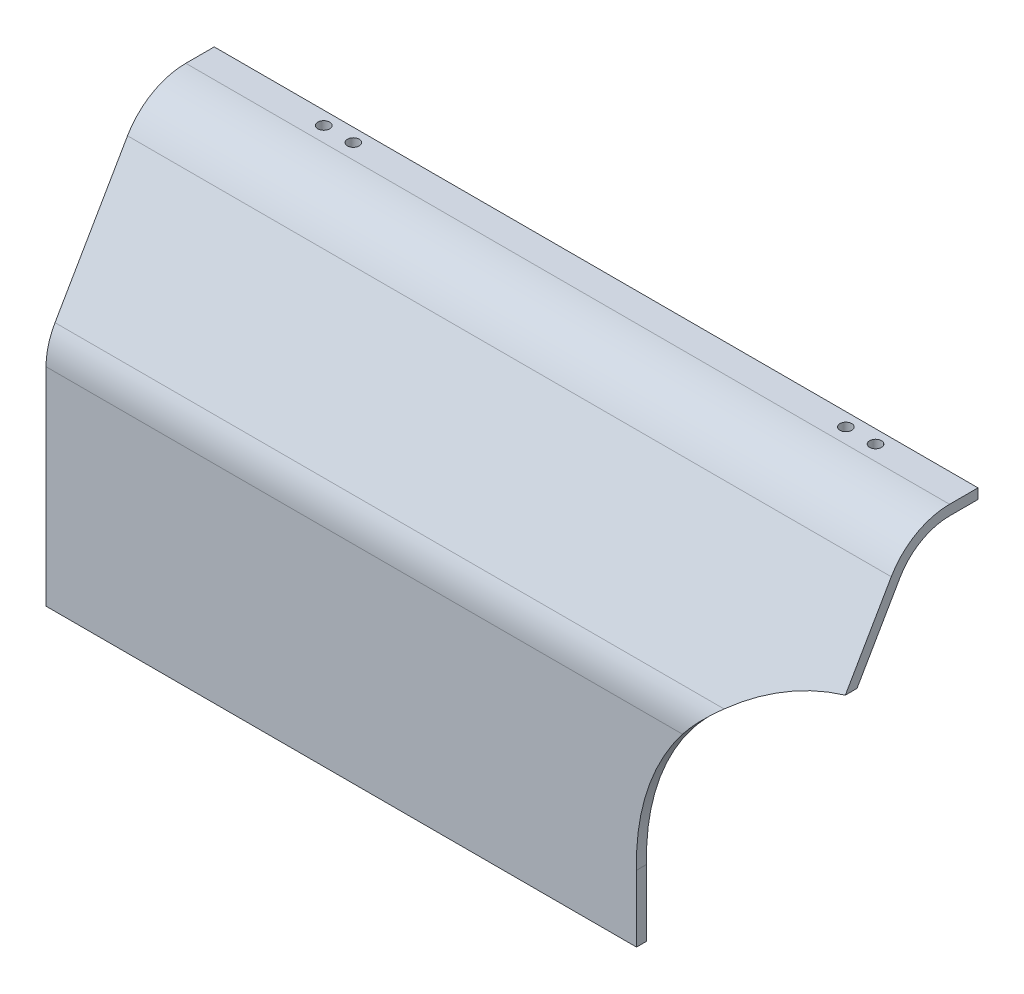
ISO-10303-21;
HEADER;
FILE_DESCRIPTION(('STEP AP214'),'2;1');
FILE_NAME('part.step','',(''),(''),'','','');
FILE_SCHEMA(('AUTOMOTIVE_DESIGN { 1 0 10303 214 1 1 1 1 }'));
ENDSEC;
DATA;
#1=APPLICATION_CONTEXT('core data for automotive mechanical design processes');
#2=APPLICATION_PROTOCOL_DEFINITION('international standard','automotive_design',2000,#1);
#3=PRODUCT_CONTEXT('',#1,'mechanical');
#4=PRODUCT('Part','Part','',(#3));
#5=PRODUCT_RELATED_PRODUCT_CATEGORY('part','',(#4));
#6=PRODUCT_DEFINITION_FORMATION('','',#4);
#7=PRODUCT_DEFINITION_CONTEXT('part definition',#1,'design');
#8=PRODUCT_DEFINITION('design','',#6,#7);
#9=PRODUCT_DEFINITION_SHAPE('','',#8);
#10=(LENGTH_UNIT() NAMED_UNIT(*) SI_UNIT(.MILLI.,.METRE.));
#11=(NAMED_UNIT(*) PLANE_ANGLE_UNIT() SI_UNIT($,.RADIAN.));
#12=(NAMED_UNIT(*) SI_UNIT($,.STERADIAN.) SOLID_ANGLE_UNIT());
#13=UNCERTAINTY_MEASURE_WITH_UNIT(LENGTH_MEASURE(1.E-05),#10,'distance_accuracy_value','');
#14=(GEOMETRIC_REPRESENTATION_CONTEXT(3) GLOBAL_UNCERTAINTY_ASSIGNED_CONTEXT((#13)) GLOBAL_UNIT_ASSIGNED_CONTEXT((#10,
#11,#12)) REPRESENTATION_CONTEXT('',''));
#15=CARTESIAN_POINT('',(0.,0.,0.));
#16=DIRECTION('',(0.,0.,1.));
#17=DIRECTION('',(1.,0.,0.));
#18=AXIS2_PLACEMENT_3D('',#15,#16,#17);
#19=CARTESIAN_POINT('',(126.978079309447,21.7215242270664,-46.9999999999999));
#20=DIRECTION('',(0.,0.,1.));
#21=DIRECTION('',(1.,0.,0.));
#22=AXIS2_PLACEMENT_3D('',#19,#20,#21);
#23=CYLINDRICAL_SURFACE('',#22,65.);
#24=DIRECTION('',(0.,0.,1.));
#25=VECTOR('',#24,1.);
#26=CARTESIAN_POINT('',(62.0070393434519,19.7814299672324,-46.9999999999999));
#27=LINE('',#26,#25);
#28=CARTESIAN_POINT('',(62.0070393434519,19.7814299672324,0.));
#29=VERTEX_POINT('',#28);
#30=CARTESIAN_POINT('',(62.0070393434519,19.7814299672324,3.));
#31=VERTEX_POINT('',#30);
#32=EDGE_CURVE('E11',#29,#31,#27,.T.);
#33=ORIENTED_EDGE('',*,*,#32,.F.);
#34=CARTESIAN_POINT('',(126.978079309447,21.7215242270664,0.));
#35=DIRECTION('',(0.,0.,1.));
#36=DIRECTION('',(1.,0.,0.));
#37=AXIS2_PLACEMENT_3D('',#34,#35,#36);
#38=CIRCLE('',#37,65.);
#39=CARTESIAN_POINT('',(75.6805728933955,61.6410161513776,0.));
#40=VERTEX_POINT('',#39);
#41=EDGE_CURVE('E73',#40,#29,#38,.T.);
#42=ORIENTED_EDGE('',*,*,#41,.F.);
#43=CARTESIAN_POINT('',(83.6127382893241,70.1410161513775,-2.27756813566452));
#44=CARTESIAN_POINT('',(83.3616480089941,69.9161368445691,-2.14774277892059));
#45=CARTESIAN_POINT('',(83.1108968713338,69.6880378023944,-2.022910582567));
#46=CARTESIAN_POINT('',(82.6103880980552,69.225461955044,-1.78342741323763));
#47=CARTESIAN_POINT('',(82.3606305217447,68.9909847755029,-1.66877703957697));
#48=CARTESIAN_POINT('',(81.6129110690012,68.2776855465004,-1.34021349171037));
#49=CARTESIAN_POINT('',(81.1169615795753,67.7894061751419,-1.14192540380267));
#50=CARTESIAN_POINT('',(80.1410265578371,66.7966579221638,-0.792221566908949));
#51=CARTESIAN_POINT('',(79.6609128884381,66.2925504696603,-0.640135838045368));
#52=CARTESIAN_POINT('',(78.711846950537,65.2630049176842,-0.38185912734132));
#53=CARTESIAN_POINT('',(78.2428877036457,64.7375807424716,-0.275638697577599));
#54=CARTESIAN_POINT('',(77.4226029410888,63.7876039616179,-0.130847975804375));
#55=CARTESIAN_POINT('',(77.0685241862307,63.3669160665213,-0.082439506259715));
#56=CARTESIAN_POINT('',(76.3679292860928,62.5127073981101,-0.0169332948677176));
#57=CARTESIAN_POINT('',(76.0214706384217,62.079125185968,-2.3470333731656E-05));
#58=CARTESIAN_POINT('',(75.6805728933955,61.6410161513775,0.));
#59=B_SPLINE_CURVE_WITH_KNOTS('',3,(#43,#44,#45,#46,#47,#48,#49,#50,#51,#52,#53,#54,#55,#56,#57,
#58),.UNSPECIFIED.,.F.,.F.,(4,2,2,2,2,2,2,4),(0.,1.0835220942305,2.16710792374517,
4.33625556596512,6.47225509648827,8.60688115684938,10.2618277297827,11.9266162888067),.UNSPECIFIED.);
#60=CARTESIAN_POINT('',(83.6127382893241,70.1410161513775,-2.27756813566452));
#61=VERTEX_POINT('',#60);
#62=EDGE_CURVE('E49',#61,#40,#59,.T.);
#63=ORIENTED_EDGE('',*,*,#62,.F.);
#64=CARTESIAN_POINT('',(126.978079309447,21.7215242270664,25.6774385608612));
#65=DIRECTION('',(0.,0.499999999999998,0.86602540378444));
#66=DIRECTION('',(0.,-0.86602540378444,0.499999999999998));
#67=AXIS2_PLACEMENT_3D('',#64,#65,#66);
#68=ELLIPSE('',#67,75.0555349946512,65.);
#69=CARTESIAN_POINT('',(113.5,85.3087979390935,-11.0346910338118));
#70=VERTEX_POINT('',#69);
#71=EDGE_CURVE('E168',#70,#61,#68,.T.);
#72=ORIENTED_EDGE('',*,*,#71,.F.);
#73=DIRECTION('',(0.,0.,1.));
#74=VECTOR('',#73,1.);
#75=CARTESIAN_POINT('',(113.5,85.3087979390935,-46.9999999999999));
#76=LINE('',#75,#74);
#77=CARTESIAN_POINT('',(113.5,85.3087979390935,-7.57058941867404));
#78=VERTEX_POINT('',#77);
#79=EDGE_CURVE('E173',#70,#78,#76,.T.);
#80=ORIENTED_EDGE('',*,*,#79,.T.);
#81=CARTESIAN_POINT('',(126.978079309447,21.7215242270664,29.141540175999));
#82=DIRECTION('',(0.,-0.499999999999998,-0.86602540378444));
#83=DIRECTION('',(0.,-0.86602540378444,0.499999999999998));
#84=AXIS2_PLACEMENT_3D('',#81,#82,#83);
#85=ELLIPSE('',#84,75.0555349946512,65.);
#86=CARTESIAN_POINT('',(85.3482303303957,71.6410161513775,0.320508075688807));
#87=VERTEX_POINT('',#86);
#88=EDGE_CURVE('E174',#87,#78,#85,.T.);
#89=ORIENTED_EDGE('',*,*,#88,.F.);
#90=CARTESIAN_POINT('',(85.3482303303956,71.6410161513775,0.320508075688803));
#91=CARTESIAN_POINT('',(85.0423347646692,71.385918487348,0.467779956475838));
#92=CARTESIAN_POINT('',(84.7373359272004,71.1267991919212,0.60987739744638));
#93=CARTESIAN_POINT('',(84.1294442324611,70.6005189772911,0.883381530419765));
#94=CARTESIAN_POINT('',(83.8265515489721,70.3333574039779,1.01478734959493));
#95=CARTESIAN_POINT('',(82.9209274384237,69.5192919046817,1.39269041840845));
#96=CARTESIAN_POINT('',(82.3219093985911,68.9603560010269,1.62255494704336));
#97=CARTESIAN_POINT('',(81.1463496848747,67.820467219122,2.03090085386978));
#98=CARTESIAN_POINT('',(80.5696033676565,67.2399916512797,2.21012542733044));
#99=CARTESIAN_POINT('',(79.4324335028515,66.0508336653938,2.51743662817031));
#100=CARTESIAN_POINT('',(78.8719990872263,65.4421707621948,2.64555806192083));
#101=CARTESIAN_POINT('',(77.8680197777471,64.3087208396667,2.82805757506313));
#102=CARTESIAN_POINT('',(77.4213498218331,63.7881671355725,2.89147658535113));
#103=CARTESIAN_POINT('',(76.7613349076728,62.9937692173334,2.95598294088116));
#104=CARTESIAN_POINT('',(76.542306109056,62.7258239609559,2.97238423065183));
#105=CARTESIAN_POINT('',(76.108319001179,62.1861687636352,2.99439233464156));
#106=CARTESIAN_POINT('',(75.8933611867286,61.9144583719194,2.99999784491459));
#107=CARTESIAN_POINT('',(75.6805728933956,61.6410161513776,3.));
#108=B_SPLINE_CURVE_WITH_KNOTS('',3,(#90,#91,#92,#93,#94,#95,#96,#97,#98,#99,#100,#101,#102,
#103,#104,#105,#106,#107),.UNSPECIFIED.,.F.,.F.,(4,2,2,2,2,2,2,2,4),(0.,1.27387284327257,
2.5478495770697,5.09854318077426,7.60958681315375,10.1189172401118,12.1838951410936,
13.2230970100514,14.2624243890008),.UNSPECIFIED.);
#109=CARTESIAN_POINT('',(75.6805728933956,61.6410161513776,3.));
#110=VERTEX_POINT('',#109);
#111=EDGE_CURVE('E164',#87,#110,#108,.T.);
#112=ORIENTED_EDGE('',*,*,#111,.T.);
#113=CARTESIAN_POINT('',(126.978079309447,21.7215242270664,3.));
#114=DIRECTION('',(0.,0.,1.));
#115=DIRECTION('',(1.,0.,0.));
#116=AXIS2_PLACEMENT_3D('',#113,#114,#115);
#117=CIRCLE('',#116,65.);
#118=EDGE_CURVE('E156',#110,#31,#117,.T.);
#119=ORIENTED_EDGE('',*,*,#118,.T.);
#120=EDGE_LOOP('',(#33,#42,#63,#72,#80,#89,#112,#119));
#121=FACE_BOUND('',#120,.T.);
#122=ADVANCED_FACE('F44',(#121),#23,.F.);
#123=CARTESIAN_POINT('',(113.5,67.,3.));
#124=DIRECTION('',(0.,0.,-1.));
#125=DIRECTION('',(0.,1.,0.));
#126=AXIS2_PLACEMENT_3D('',#123,#124,#125);
#127=PLANE('',#126);
#128=DIRECTION('',(0.,-1.,0.));
#129=VECTOR('',#128,1.);
#130=CARTESIAN_POINT('',(62.0070393434519,0.,3.));
#131=LINE('',#130,#129);
#132=CARTESIAN_POINT('',(62.0070393434519,0.,3.));
#133=VERTEX_POINT('',#132);
#134=EDGE_CURVE('E155',#31,#133,#131,.T.);
#135=ORIENTED_EDGE('',*,*,#134,.F.);
#136=ORIENTED_EDGE('',*,*,#118,.F.);
#137=DIRECTION('',(-1.,0.,0.));
#138=VECTOR('',#137,1.);
#139=CARTESIAN_POINT('',(113.5,61.6410161513776,3.));
#140=LINE('',#139,#138);
#141=CARTESIAN_POINT('',(-113.5,61.6410161513776,3.));
#142=VERTEX_POINT('',#141);
#143=EDGE_CURVE('E256',#110,#142,#140,.T.);
#144=ORIENTED_EDGE('',*,*,#143,.T.);
#145=DIRECTION('',(0.,-1.,0.));
#146=VECTOR('',#145,1.);
#147=CARTESIAN_POINT('',(-113.5,67.,3.));
#148=LINE('',#147,#146);
#149=CARTESIAN_POINT('',(-113.5,0.,3.));
#150=VERTEX_POINT('',#149);
#151=EDGE_CURVE('E316',#142,#150,#148,.T.);
#152=ORIENTED_EDGE('',*,*,#151,.T.);
#153=DIRECTION('',(-1.,0.,0.));
#154=VECTOR('',#153,1.);
#155=CARTESIAN_POINT('',(113.5,0.,3.));
#156=LINE('',#155,#154);
#157=EDGE_CURVE('E162',#133,#150,#156,.T.);
#158=ORIENTED_EDGE('',*,*,#157,.F.);
#159=EDGE_LOOP('',(#135,#136,#144,#152,#158));
#160=FACE_BOUND('',#159,.T.);
#161=ADVANCED_FACE('F159',(#160),#127,.F.);
#162=CARTESIAN_POINT('',(113.5,0.,3.));
#163=DIRECTION('',(0.,1.,0.));
#164=DIRECTION('',(0.,0.,1.));
#165=AXIS2_PLACEMENT_3D('',#162,#163,#164);
#166=PLANE('',#165);
#167=DIRECTION('',(-1.,0.,0.));
#168=VECTOR('',#167,1.);
#169=CARTESIAN_POINT('',(113.5,0.,0.));
#170=LINE('',#169,#168);
#171=CARTESIAN_POINT('',(62.0070393434519,0.,0.));
#172=VERTEX_POINT('',#171);
#173=CARTESIAN_POINT('',(-113.5,0.,0.));
#174=VERTEX_POINT('',#173);
#175=EDGE_CURVE('E255',#172,#174,#170,.T.);
#176=ORIENTED_EDGE('',*,*,#175,.F.);
#177=DIRECTION('',(0.,0.,1.));
#178=VECTOR('',#177,1.);
#179=CARTESIAN_POINT('',(62.0070393434519,0.,-46.9999999999999));
#180=LINE('',#179,#178);
#181=EDGE_CURVE('E70',#172,#133,#180,.T.);
#182=ORIENTED_EDGE('',*,*,#181,.T.);
#183=ORIENTED_EDGE('',*,*,#157,.T.);
#184=DIRECTION('',(0.,0.,-1.));
#185=VECTOR('',#184,1.);
#186=CARTESIAN_POINT('',(-113.5,0.,3.));
#187=LINE('',#186,#185);
#188=EDGE_CURVE('E251',#150,#174,#187,.T.);
#189=ORIENTED_EDGE('',*,*,#188,.T.);
#190=EDGE_LOOP('',(#176,#182,#183,#189));
#191=FACE_BOUND('',#190,.T.);
#192=ADVANCED_FACE('F224',(#191),#166,.F.);
#193=CARTESIAN_POINT('',(113.5,0.,0.));
#194=DIRECTION('',(0.,0.,1.));
#195=DIRECTION('',(1.,0.,0.));
#196=AXIS2_PLACEMENT_3D('',#193,#194,#195);
#197=PLANE('',#196);
#198=ORIENTED_EDGE('',*,*,#41,.T.);
#199=DIRECTION('',(0.,-1.,0.));
#200=VECTOR('',#199,1.);
#201=CARTESIAN_POINT('',(62.0070393434519,0.,0.));
#202=LINE('',#201,#200);
#203=EDGE_CURVE('E154',#29,#172,#202,.T.);
#204=ORIENTED_EDGE('',*,*,#203,.T.);
#205=ORIENTED_EDGE('',*,*,#175,.T.);
#206=DIRECTION('',(0.,1.,0.));
#207=VECTOR('',#206,1.);
#208=CARTESIAN_POINT('',(-113.5,0.,0.));
#209=LINE('',#208,#207);
#210=CARTESIAN_POINT('',(-113.5,61.6410161513776,0.));
#211=VERTEX_POINT('',#210);
#212=EDGE_CURVE('E305',#174,#211,#209,.T.);
#213=ORIENTED_EDGE('',*,*,#212,.T.);
#214=DIRECTION('',(-1.,0.,0.));
#215=VECTOR('',#214,1.);
#216=CARTESIAN_POINT('',(113.5,61.6410161513776,0.));
#217=LINE('',#216,#215);
#218=EDGE_CURVE('E295',#211,#40,#217,.F.);
#219=ORIENTED_EDGE('',*,*,#218,.T.);
#220=EDGE_LOOP('',(#198,#204,#205,#213,#219));
#221=FACE_BOUND('',#220,.T.);
#222=ADVANCED_FACE('F245',(#221),#197,.F.);
#223=CARTESIAN_POINT('',(113.5,66.1961524227066,0.));
#224=DIRECTION('',(0.,0.499999999999998,0.86602540378444));
#225=DIRECTION('',(0.,-0.86602540378444,0.499999999999998));
#226=AXIS2_PLACEMENT_3D('',#223,#224,#225);
#227=PLANE('',#226);
#228=DIRECTION('',(0.,0.86602540378444,-0.499999999999998));
#229=VECTOR('',#228,1.);
#230=CARTESIAN_POINT('',(113.5,66.1961524227066,0.));
#231=LINE('',#230,#229);
#232=CARTESIAN_POINT('',(113.5,107.461524227066,-23.8245735194569));
#233=VERTEX_POINT('',#232);
#234=EDGE_CURVE('E324',#70,#233,#231,.T.);
#235=ORIENTED_EDGE('',*,*,#234,.F.);
#236=ORIENTED_EDGE('',*,*,#71,.T.);
#237=DIRECTION('',(-1.,0.,0.));
#238=VECTOR('',#237,1.);
#239=CARTESIAN_POINT('',(-113.5,70.1410161513775,-2.27756813566452));
#240=LINE('',#239,#238);
#241=CARTESIAN_POINT('',(-113.5,70.1410161513775,-2.27756813566452));
#242=VERTEX_POINT('',#241);
#243=EDGE_CURVE('E292',#61,#242,#240,.T.);
#244=ORIENTED_EDGE('',*,*,#243,.T.);
#245=DIRECTION('',(0.,0.86602540378444,-0.499999999999998));
#246=VECTOR('',#245,1.);
#247=CARTESIAN_POINT('',(-113.5,66.1961524227066,0.));
#248=LINE('',#247,#246);
#249=CARTESIAN_POINT('',(-113.5,107.461524227066,-23.8245735194569));
#250=VERTEX_POINT('',#249);
#251=EDGE_CURVE('E303',#242,#250,#248,.T.);
#252=ORIENTED_EDGE('',*,*,#251,.T.);
#253=DIRECTION('',(-1.,0.,0.));
#254=VECTOR('',#253,1.);
#255=CARTESIAN_POINT('',(113.5,107.461524227066,-23.8245735194569));
#256=LINE('',#255,#254);
#257=EDGE_CURVE('E281',#250,#233,#256,.F.);
#258=ORIENTED_EDGE('',*,*,#257,.T.);
#259=EDGE_LOOP('',(#235,#236,#244,#252,#258));
#260=FACE_BOUND('',#259,.T.);
#261=ADVANCED_FACE('F238',(#260),#227,.F.);
#262=CARTESIAN_POINT('',(113.5,115.961524227066,-28.7320508075688));
#263=DIRECTION('',(0.,1.,0.));
#264=DIRECTION('',(0.,0.,1.));
#265=AXIS2_PLACEMENT_3D('',#262,#263,#264);
#266=PLANE('',#265);
#267=CARTESIAN_POINT('',(78.2,115.961524227066,-43.0470053837925));
#268=DIRECTION('',(0.,1.,0.));
#269=DIRECTION('',(0.,0.,1.));
#270=AXIS2_PLACEMENT_3D('',#267,#268,#269);
#271=CIRCLE('',#270,1.75);
#272=CARTESIAN_POINT('',(78.2,115.961524227066,-41.2970053837925));
#273=VERTEX_POINT('',#272);
#274=EDGE_CURVE('E356',#273,#273,#271,.T.);
#275=ORIENTED_EDGE('',*,*,#274,.T.);
#276=EDGE_LOOP('',(#275));
#277=FACE_BOUND('',#276,.T.);
#278=CARTESIAN_POINT('',(87.,115.961524227066,-43.0470053837925));
#279=DIRECTION('',(0.,1.,0.));
#280=DIRECTION('',(0.,0.,1.));
#281=AXIS2_PLACEMENT_3D('',#278,#279,#280);
#282=CIRCLE('',#281,1.75);
#283=CARTESIAN_POINT('',(87.,115.961524227066,-41.2970053837925));
#284=VERTEX_POINT('',#283);
#285=EDGE_CURVE('E361',#284,#284,#282,.T.);
#286=ORIENTED_EDGE('',*,*,#285,.T.);
#287=EDGE_LOOP('',(#286));
#288=FACE_BOUND('',#287,.T.);
#289=CARTESIAN_POINT('',(-77.,115.961524227066,-43.047005383793));
#290=DIRECTION('',(0.,1.,0.));
#291=DIRECTION('',(0.,0.,1.));
#292=AXIS2_PLACEMENT_3D('',#289,#290,#291);
#293=CIRCLE('',#292,1.75000000000001);
#294=CARTESIAN_POINT('',(-77.,115.961524227066,-41.297005383793));
#295=VERTEX_POINT('',#294);
#296=EDGE_CURVE('E310',#295,#295,#293,.T.);
#297=ORIENTED_EDGE('',*,*,#296,.T.);
#298=EDGE_LOOP('',(#297));
#299=FACE_BOUND('',#298,.T.);
#300=CARTESIAN_POINT('',(-68.2,115.961524227066,-43.047005383793));
#301=DIRECTION('',(0.,1.,0.));
#302=DIRECTION('',(0.,0.,1.));
#303=AXIS2_PLACEMENT_3D('',#300,#301,#302);
#304=CIRCLE('',#303,1.75);
#305=CARTESIAN_POINT('',(-68.2,115.961524227066,-41.297005383793));
#306=VERTEX_POINT('',#305);
#307=EDGE_CURVE('E352',#306,#306,#304,.T.);
#308=ORIENTED_EDGE('',*,*,#307,.T.);
#309=EDGE_LOOP('',(#308));
#310=FACE_BOUND('',#309,.T.);
#311=DIRECTION('',(0.,0.,-1.));
#312=VECTOR('',#311,1.);
#313=CARTESIAN_POINT('',(113.5,115.961524227066,-28.7320508075688));
#314=LINE('',#313,#312);
#315=CARTESIAN_POINT('',(113.5,115.961524227066,-38.5470053837924));
#316=VERTEX_POINT('',#315);
#317=CARTESIAN_POINT('',(113.5,115.961524227066,-46.9999999999999));
#318=VERTEX_POINT('',#317);
#319=EDGE_CURVE('E347',#316,#318,#314,.T.);
#320=ORIENTED_EDGE('',*,*,#319,.F.);
#321=DIRECTION('',(-1.,0.,0.));
#322=VECTOR('',#321,1.);
#323=CARTESIAN_POINT('',(-113.5,115.961524227066,-38.5470053837924));
#324=LINE('',#323,#322);
#325=CARTESIAN_POINT('',(-113.5,115.961524227066,-38.5470053837924));
#326=VERTEX_POINT('',#325);
#327=EDGE_CURVE('E282',#316,#326,#324,.T.);
#328=ORIENTED_EDGE('',*,*,#327,.T.);
#329=DIRECTION('',(0.,0.,-1.));
#330=VECTOR('',#329,1.);
#331=CARTESIAN_POINT('',(-113.5,115.961524227066,-28.7320508075688));
#332=LINE('',#331,#330);
#333=CARTESIAN_POINT('',(-113.5,115.961524227066,-46.9999999999999));
#334=VERTEX_POINT('',#333);
#335=EDGE_CURVE('E304',#326,#334,#332,.T.);
#336=ORIENTED_EDGE('',*,*,#335,.T.);
#337=DIRECTION('',(-1.,0.,0.));
#338=VECTOR('',#337,1.);
#339=CARTESIAN_POINT('',(113.5,115.961524227066,-46.9999999999999));
#340=LINE('',#339,#338);
#341=EDGE_CURVE('E260',#318,#334,#340,.T.);
#342=ORIENTED_EDGE('',*,*,#341,.F.);
#343=EDGE_LOOP('',(#320,#328,#336,#342));
#344=FACE_BOUND('',#343,.T.);
#345=ADVANCED_FACE('F234',(#277,#288,#299,#310,#344),#266,.F.);
#346=CARTESIAN_POINT('',(113.5,115.961524227066,-46.9999999999999));
#347=DIRECTION('',(0.,0.,1.));
#348=DIRECTION('',(1.,0.,0.));
#349=AXIS2_PLACEMENT_3D('',#346,#347,#348);
#350=PLANE('',#349);
#351=DIRECTION('',(0.,1.,0.));
#352=VECTOR('',#351,1.);
#353=CARTESIAN_POINT('',(-113.5,115.961524227066,-46.9999999999999));
#354=LINE('',#353,#352);
#355=CARTESIAN_POINT('',(-113.5,118.961524227066,-46.9999999999999));
#356=VERTEX_POINT('',#355);
#357=EDGE_CURVE('E315',#334,#356,#354,.T.);
#358=ORIENTED_EDGE('',*,*,#357,.T.);
#359=DIRECTION('',(-1.,0.,0.));
#360=VECTOR('',#359,1.);
#361=CARTESIAN_POINT('',(113.5,118.961524227066,-46.9999999999999));
#362=LINE('',#361,#360);
#363=CARTESIAN_POINT('',(113.5,118.961524227066,-46.9999999999999));
#364=VERTEX_POINT('',#363);
#365=EDGE_CURVE('E264',#364,#356,#362,.T.);
#366=ORIENTED_EDGE('',*,*,#365,.F.);
#367=DIRECTION('',(0.,1.,0.));
#368=VECTOR('',#367,1.);
#369=CARTESIAN_POINT('',(113.5,115.961524227066,-46.9999999999999));
#370=LINE('',#369,#368);
#371=EDGE_CURVE('E341',#318,#364,#370,.T.);
#372=ORIENTED_EDGE('',*,*,#371,.F.);
#373=ORIENTED_EDGE('',*,*,#341,.T.);
#374=EDGE_LOOP('',(#358,#366,#372,#373));
#375=FACE_BOUND('',#374,.T.);
#376=ADVANCED_FACE('F229',(#375),#350,.F.);
#377=CARTESIAN_POINT('',(113.5,118.961524227066,-46.9999999999999));
#378=DIRECTION('',(0.,-1.,0.));
#379=DIRECTION('',(0.,0.,-1.));
#380=AXIS2_PLACEMENT_3D('',#377,#378,#379);
#381=PLANE('',#380);
#382=CARTESIAN_POINT('',(78.2,118.961524227066,-43.0470053837925));
#383=DIRECTION('',(0.,1.,0.));
#384=DIRECTION('',(0.,0.,1.));
#385=AXIS2_PLACEMENT_3D('',#382,#383,#384);
#386=CIRCLE('',#385,1.75);
#387=CARTESIAN_POINT('',(78.2,118.961524227066,-41.2970053837925));
#388=VERTEX_POINT('',#387);
#389=EDGE_CURVE('E184',#388,#388,#386,.T.);
#390=ORIENTED_EDGE('',*,*,#389,.F.);
#391=EDGE_LOOP('',(#390));
#392=FACE_BOUND('',#391,.T.);
#393=CARTESIAN_POINT('',(87.,118.961524227066,-43.0470053837925));
#394=DIRECTION('',(0.,1.,0.));
#395=DIRECTION('',(0.,0.,1.));
#396=AXIS2_PLACEMENT_3D('',#393,#394,#395);
#397=CIRCLE('',#396,1.75);
#398=CARTESIAN_POINT('',(87.,118.961524227066,-41.2970053837925));
#399=VERTEX_POINT('',#398);
#400=EDGE_CURVE('E183',#399,#399,#397,.T.);
#401=ORIENTED_EDGE('',*,*,#400,.F.);
#402=EDGE_LOOP('',(#401));
#403=FACE_BOUND('',#402,.T.);
#404=CARTESIAN_POINT('',(-77.,118.961524227066,-43.047005383793));
#405=DIRECTION('',(0.,1.,0.));
#406=DIRECTION('',(0.,0.,1.));
#407=AXIS2_PLACEMENT_3D('',#404,#405,#406);
#408=CIRCLE('',#407,1.75000000000001);
#409=CARTESIAN_POINT('',(-77.,118.961524227066,-41.297005383793));
#410=VERTEX_POINT('',#409);
#411=EDGE_CURVE('E351',#410,#410,#408,.T.);
#412=ORIENTED_EDGE('',*,*,#411,.F.);
#413=EDGE_LOOP('',(#412));
#414=FACE_BOUND('',#413,.T.);
#415=CARTESIAN_POINT('',(-68.2,118.961524227066,-43.047005383793));
#416=DIRECTION('',(0.,1.,0.));
#417=DIRECTION('',(0.,0.,1.));
#418=AXIS2_PLACEMENT_3D('',#415,#416,#417);
#419=CIRCLE('',#418,1.75);
#420=CARTESIAN_POINT('',(-68.2,118.961524227066,-41.297005383793));
#421=VERTEX_POINT('',#420);
#422=EDGE_CURVE('E353',#421,#421,#419,.T.);
#423=ORIENTED_EDGE('',*,*,#422,.F.);
#424=EDGE_LOOP('',(#423));
#425=FACE_BOUND('',#424,.T.);
#426=DIRECTION('',(0.,0.,1.));
#427=VECTOR('',#426,1.);
#428=CARTESIAN_POINT('',(-113.5,118.961524227066,-46.9999999999999));
#429=LINE('',#428,#427);
#430=CARTESIAN_POINT('',(-113.5,118.961524227066,-38.5470053837924));
#431=VERTEX_POINT('',#430);
#432=EDGE_CURVE('E313',#356,#431,#429,.T.);
#433=ORIENTED_EDGE('',*,*,#432,.T.);
#434=DIRECTION('',(-1.,0.,0.));
#435=VECTOR('',#434,1.);
#436=CARTESIAN_POINT('',(113.5,118.961524227066,-38.5470053837924));
#437=LINE('',#436,#435);
#438=CARTESIAN_POINT('',(113.5,118.961524227066,-38.5470053837924));
#439=VERTEX_POINT('',#438);
#440=EDGE_CURVE('E276',#431,#439,#437,.F.);
#441=ORIENTED_EDGE('',*,*,#440,.T.);
#442=DIRECTION('',(0.,0.,1.));
#443=VECTOR('',#442,1.);
#444=CARTESIAN_POINT('',(113.5,118.961524227066,-46.9999999999999));
#445=LINE('',#444,#443);
#446=EDGE_CURVE('E328',#364,#439,#445,.T.);
#447=ORIENTED_EDGE('',*,*,#446,.F.);
#448=ORIENTED_EDGE('',*,*,#365,.T.);
#449=EDGE_LOOP('',(#433,#441,#447,#448));
#450=FACE_BOUND('',#449,.T.);
#451=ADVANCED_FACE('F228',(#392,#403,#414,#425,#450),#381,.F.);
#452=CARTESIAN_POINT('',(113.5,118.961524227066,-26.9999999999999));
#453=DIRECTION('',(0.,-0.499999999999998,-0.86602540378444));
#454=DIRECTION('',(0.,0.86602540378444,-0.499999999999998));
#455=AXIS2_PLACEMENT_3D('',#452,#453,#454);
#456=PLANE('',#455);
#457=DIRECTION('',(-1.,0.,0.));
#458=VECTOR('',#457,1.);
#459=CARTESIAN_POINT('',(113.5,71.6410161513775,0.320508075688807));
#460=LINE('',#459,#458);
#461=CARTESIAN_POINT('',(-113.5,71.6410161513775,0.32050807568881));
#462=VERTEX_POINT('',#461);
#463=EDGE_CURVE('E266',#462,#87,#460,.F.);
#464=ORIENTED_EDGE('',*,*,#463,.T.);
#465=ORIENTED_EDGE('',*,*,#88,.T.);
#466=DIRECTION('',(0.,-0.86602540378444,0.499999999999998));
#467=VECTOR('',#466,1.);
#468=CARTESIAN_POINT('',(113.5,118.961524227066,-26.9999999999999));
#469=LINE('',#468,#467);
#470=CARTESIAN_POINT('',(113.5,108.961524227066,-21.2264973081036));
#471=VERTEX_POINT('',#470);
#472=EDGE_CURVE('E321',#471,#78,#469,.T.);
#473=ORIENTED_EDGE('',*,*,#472,.F.);
#474=DIRECTION('',(-1.,0.,0.));
#475=VECTOR('',#474,1.);
#476=CARTESIAN_POINT('',(113.5,108.961524227066,-21.2264973081036));
#477=LINE('',#476,#475);
#478=CARTESIAN_POINT('',(-113.5,108.961524227066,-21.2264973081036));
#479=VERTEX_POINT('',#478);
#480=EDGE_CURVE('E275',#471,#479,#477,.T.);
#481=ORIENTED_EDGE('',*,*,#480,.T.);
#482=DIRECTION('',(0.,-0.86602540378444,0.499999999999998));
#483=VECTOR('',#482,1.);
#484=CARTESIAN_POINT('',(-113.5,118.961524227066,-26.9999999999999));
#485=LINE('',#484,#483);
#486=EDGE_CURVE('E320',#479,#462,#485,.T.);
#487=ORIENTED_EDGE('',*,*,#486,.T.);
#488=EDGE_LOOP('',(#464,#465,#473,#481,#487));
#489=FACE_BOUND('',#488,.T.);
#490=ADVANCED_FACE('F217',(#489),#456,.F.);
#491=CARTESIAN_POINT('',(113.5,0.,0.));
#492=DIRECTION('',(1.,0.,0.));
#493=DIRECTION('',(0.,0.,-1.));
#494=AXIS2_PLACEMENT_3D('',#491,#492,#493);
#495=PLANE('',#494);
#496=ORIENTED_EDGE('',*,*,#79,.F.);
#497=ORIENTED_EDGE('',*,*,#234,.T.);
#498=CARTESIAN_POINT('',(113.5,98.9615242270664,-38.5470053837924));
#499=DIRECTION('',(1.,0.,0.));
#500=DIRECTION('',(0.,0.,-1.));
#501=AXIS2_PLACEMENT_3D('',#498,#499,#500);
#502=CIRCLE('',#501,17.);
#503=EDGE_CURVE('E288',#233,#316,#502,.F.);
#504=ORIENTED_EDGE('',*,*,#503,.T.);
#505=ORIENTED_EDGE('',*,*,#319,.T.);
#506=ORIENTED_EDGE('',*,*,#371,.T.);
#507=ORIENTED_EDGE('',*,*,#446,.T.);
#508=CARTESIAN_POINT('',(113.5,98.9615242270664,-38.5470053837924));
#509=DIRECTION('',(1.,0.,0.));
#510=DIRECTION('',(0.,0.,-1.));
#511=AXIS2_PLACEMENT_3D('',#508,#509,#510);
#512=CIRCLE('',#511,20.);
#513=EDGE_CURVE('E278',#439,#471,#512,.T.);
#514=ORIENTED_EDGE('',*,*,#513,.T.);
#515=ORIENTED_EDGE('',*,*,#472,.T.);
#516=EDGE_LOOP('',(#496,#497,#504,#505,#506,#507,#514,#515));
#517=FACE_BOUND('',#516,.T.);
#518=ADVANCED_FACE('F211',(#517),#495,.T.);
#519=CARTESIAN_POINT('',(-113.5,0.,0.));
#520=DIRECTION('',(1.,0.,0.));
#521=DIRECTION('',(0.,0.,-1.));
#522=AXIS2_PLACEMENT_3D('',#519,#520,#521);
#523=PLANE('',#522);
#524=ORIENTED_EDGE('',*,*,#486,.F.);
#525=CARTESIAN_POINT('',(-113.5,98.9615242270664,-38.5470053837924));
#526=DIRECTION('',(1.,0.,0.));
#527=DIRECTION('',(0.,0.,-1.));
#528=AXIS2_PLACEMENT_3D('',#525,#526,#527);
#529=CIRCLE('',#528,20.);
#530=EDGE_CURVE('E273',#479,#431,#529,.F.);
#531=ORIENTED_EDGE('',*,*,#530,.T.);
#532=ORIENTED_EDGE('',*,*,#432,.F.);
#533=ORIENTED_EDGE('',*,*,#357,.F.);
#534=ORIENTED_EDGE('',*,*,#335,.F.);
#535=CARTESIAN_POINT('',(-113.5,98.9615242270664,-38.5470053837924));
#536=DIRECTION('',(1.,0.,0.));
#537=DIRECTION('',(0.,0.,-1.));
#538=AXIS2_PLACEMENT_3D('',#535,#536,#537);
#539=CIRCLE('',#538,17.);
#540=EDGE_CURVE('E290',#326,#250,#539,.T.);
#541=ORIENTED_EDGE('',*,*,#540,.T.);
#542=ORIENTED_EDGE('',*,*,#251,.F.);
#543=CARTESIAN_POINT('',(-113.5,61.6410161513776,-17.));
#544=DIRECTION('',(1.,0.,0.));
#545=DIRECTION('',(0.,0.,-1.));
#546=AXIS2_PLACEMENT_3D('',#543,#544,#545);
#547=CIRCLE('',#546,17.);
#548=EDGE_CURVE('E298',#242,#211,#547,.T.);
#549=ORIENTED_EDGE('',*,*,#548,.T.);
#550=ORIENTED_EDGE('',*,*,#212,.F.);
#551=ORIENTED_EDGE('',*,*,#188,.F.);
#552=ORIENTED_EDGE('',*,*,#151,.F.);
#553=CARTESIAN_POINT('',(-113.5,61.6410161513776,-17.));
#554=DIRECTION('',(1.,0.,0.));
#555=DIRECTION('',(0.,0.,-1.));
#556=AXIS2_PLACEMENT_3D('',#553,#554,#555);
#557=CIRCLE('',#556,20.);
#558=EDGE_CURVE('E257',#142,#462,#557,.F.);
#559=ORIENTED_EDGE('',*,*,#558,.T.);
#560=EDGE_LOOP('',(#524,#531,#532,#533,#534,#541,#542,#549,#550,#551,#552,#559));
#561=FACE_BOUND('',#560,.T.);
#562=ADVANCED_FACE('F212',(#561),#523,.F.);
#563=CARTESIAN_POINT('',(113.5,61.6410161513776,-17.));
#564=DIRECTION('',(-1.,0.,0.));
#565=DIRECTION('',(0.,0.,1.));
#566=AXIS2_PLACEMENT_3D('',#563,#564,#565);
#567=CYLINDRICAL_SURFACE('',#566,20.);
#568=ORIENTED_EDGE('',*,*,#111,.F.);
#569=ORIENTED_EDGE('',*,*,#463,.F.);
#570=ORIENTED_EDGE('',*,*,#558,.F.);
#571=ORIENTED_EDGE('',*,*,#143,.F.);
#572=EDGE_LOOP('',(#568,#569,#570,#571));
#573=FACE_BOUND('',#572,.T.);
#574=ADVANCED_FACE('F190',(#573),#567,.T.);
#575=CARTESIAN_POINT('',(113.5,98.9615242270664,-38.5470053837924));
#576=DIRECTION('',(-1.,0.,0.));
#577=DIRECTION('',(0.,0.,1.));
#578=AXIS2_PLACEMENT_3D('',#575,#576,#577);
#579=CYLINDRICAL_SURFACE('',#578,20.);
#580=ORIENTED_EDGE('',*,*,#513,.F.);
#581=ORIENTED_EDGE('',*,*,#440,.F.);
#582=ORIENTED_EDGE('',*,*,#530,.F.);
#583=ORIENTED_EDGE('',*,*,#480,.F.);
#584=EDGE_LOOP('',(#580,#581,#582,#583));
#585=FACE_BOUND('',#584,.T.);
#586=ADVANCED_FACE('F336',(#585),#579,.T.);
#587=CARTESIAN_POINT('',(113.5,98.9615242270664,-38.5470053837924));
#588=DIRECTION('',(1.,0.,0.));
#589=DIRECTION('',(0.,0.,-1.));
#590=AXIS2_PLACEMENT_3D('',#587,#588,#589);
#591=CYLINDRICAL_SURFACE('',#590,17.);
#592=ORIENTED_EDGE('',*,*,#503,.F.);
#593=ORIENTED_EDGE('',*,*,#257,.F.);
#594=ORIENTED_EDGE('',*,*,#540,.F.);
#595=ORIENTED_EDGE('',*,*,#327,.F.);
#596=EDGE_LOOP('',(#592,#593,#594,#595));
#597=FACE_BOUND('',#596,.T.);
#598=ADVANCED_FACE('F381',(#597),#591,.F.);
#599=CARTESIAN_POINT('',(113.5,61.6410161513776,-17.));
#600=DIRECTION('',(1.,0.,0.));
#601=DIRECTION('',(0.,0.,-1.));
#602=AXIS2_PLACEMENT_3D('',#599,#600,#601);
#603=CYLINDRICAL_SURFACE('',#602,17.);
#604=ORIENTED_EDGE('',*,*,#243,.F.);
#605=ORIENTED_EDGE('',*,*,#62,.T.);
#606=ORIENTED_EDGE('',*,*,#218,.F.);
#607=ORIENTED_EDGE('',*,*,#548,.F.);
#608=EDGE_LOOP('',(#604,#605,#606,#607));
#609=FACE_BOUND('',#608,.T.);
#610=ADVANCED_FACE('F50',(#609),#603,.F.);
#611=CARTESIAN_POINT('',(-68.2,114.961524227066,-43.047005383793));
#612=DIRECTION('',(0.,1.,0.));
#613=DIRECTION('',(0.,0.,1.));
#614=AXIS2_PLACEMENT_3D('',#611,#612,#613);
#615=CYLINDRICAL_SURFACE('',#614,1.75);
#616=ORIENTED_EDGE('',*,*,#422,.T.);
#617=EDGE_LOOP('',(#616));
#618=FACE_BOUND('',#617,.T.);
#619=ORIENTED_EDGE('',*,*,#307,.F.);
#620=EDGE_LOOP('',(#619));
#621=FACE_BOUND('',#620,.T.);
#622=ADVANCED_FACE('F210',(#618,#621),#615,.F.);
#623=CARTESIAN_POINT('',(-77.,114.961524227066,-43.047005383793));
#624=DIRECTION('',(0.,1.,0.));
#625=DIRECTION('',(0.,0.,1.));
#626=AXIS2_PLACEMENT_3D('',#623,#624,#625);
#627=CYLINDRICAL_SURFACE('',#626,1.75000000000001);
#628=ORIENTED_EDGE('',*,*,#411,.T.);
#629=EDGE_LOOP('',(#628));
#630=FACE_BOUND('',#629,.T.);
#631=ORIENTED_EDGE('',*,*,#296,.F.);
#632=EDGE_LOOP('',(#631));
#633=FACE_BOUND('',#632,.T.);
#634=ADVANCED_FACE('F204',(#630,#633),#627,.F.);
#635=CARTESIAN_POINT('',(87.,114.961524227066,-43.0470053837925));
#636=DIRECTION('',(0.,1.,0.));
#637=DIRECTION('',(0.,0.,1.));
#638=AXIS2_PLACEMENT_3D('',#635,#636,#637);
#639=CYLINDRICAL_SURFACE('',#638,1.75);
#640=ORIENTED_EDGE('',*,*,#400,.T.);
#641=EDGE_LOOP('',(#640));
#642=FACE_BOUND('',#641,.T.);
#643=ORIENTED_EDGE('',*,*,#285,.F.);
#644=EDGE_LOOP('',(#643));
#645=FACE_BOUND('',#644,.T.);
#646=ADVANCED_FACE('F196',(#642,#645),#639,.F.);
#647=CARTESIAN_POINT('',(78.2,114.961524227066,-43.0470053837925));
#648=DIRECTION('',(0.,1.,0.));
#649=DIRECTION('',(0.,0.,1.));
#650=AXIS2_PLACEMENT_3D('',#647,#648,#649);
#651=CYLINDRICAL_SURFACE('',#650,1.75);
#652=ORIENTED_EDGE('',*,*,#389,.T.);
#653=EDGE_LOOP('',(#652));
#654=FACE_BOUND('',#653,.T.);
#655=ORIENTED_EDGE('',*,*,#274,.F.);
#656=EDGE_LOOP('',(#655));
#657=FACE_BOUND('',#656,.T.);
#658=ADVANCED_FACE('F192',(#654,#657),#651,.F.);
#659=CARTESIAN_POINT('',(62.0070393434519,0.,-46.9999999999999));
#660=DIRECTION('',(-1.,0.,0.));
#661=DIRECTION('',(0.,0.,1.));
#662=AXIS2_PLACEMENT_3D('',#659,#660,#661);
#663=PLANE('',#662);
#664=ORIENTED_EDGE('',*,*,#32,.T.);
#665=ORIENTED_EDGE('',*,*,#134,.T.);
#666=ORIENTED_EDGE('',*,*,#181,.F.);
#667=ORIENTED_EDGE('',*,*,#203,.F.);
#668=EDGE_LOOP('',(#664,#665,#666,#667));
#669=FACE_BOUND('',#668,.T.);
#670=ADVANCED_FACE('F152',(#669),#663,.F.);
#671=CLOSED_SHELL('',(#122,#161,#192,#222,#261,#345,#376,#451,#490,#518,#562,#574,#586,#598,
#610,#622,#634,#646,#658,#670));
#672=MANIFOLD_SOLID_BREP('B2',#671);
#673=ADVANCED_BREP_SHAPE_REPRESENTATION('',(#18,#672),#14);
#674=SHAPE_DEFINITION_REPRESENTATION(#9,#673);
ENDSEC;
END-ISO-10303-21;
